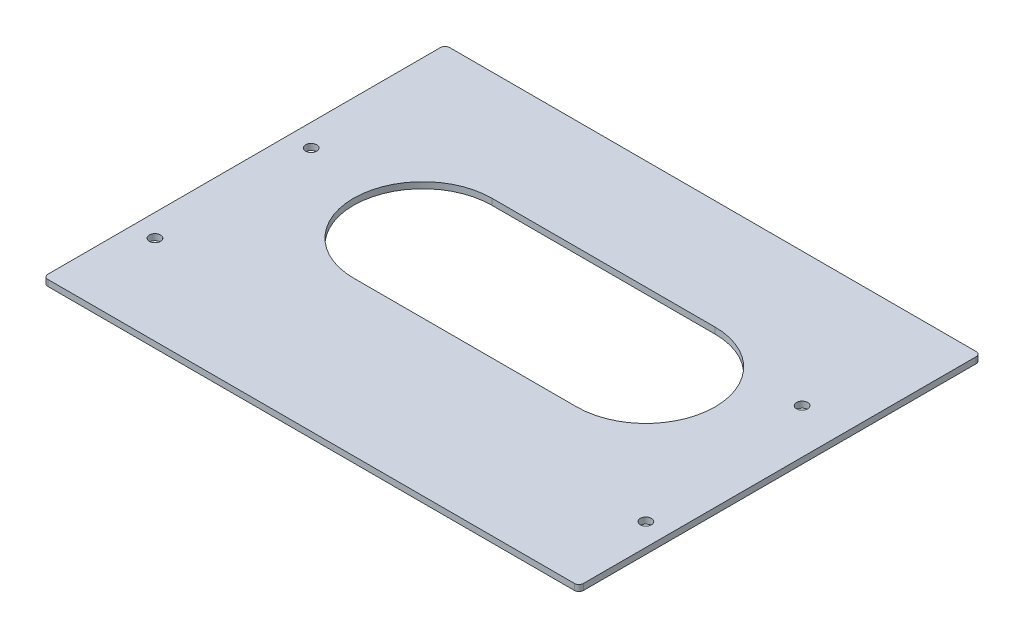
ISO-10303-21;
HEADER;
FILE_DESCRIPTION(('STEP AP214'),'2;1');
FILE_NAME('part.step','',(''),(''),'','','');
FILE_SCHEMA(('AUTOMOTIVE_DESIGN { 1 0 10303 214 1 1 1 1 }'));
ENDSEC;
DATA;
#1=APPLICATION_CONTEXT('core data for automotive mechanical design processes');
#2=APPLICATION_PROTOCOL_DEFINITION('international standard','automotive_design',2000,#1);
#3=PRODUCT_CONTEXT('',#1,'mechanical');
#4=PRODUCT('Part','Part','',(#3));
#5=PRODUCT_RELATED_PRODUCT_CATEGORY('part','',(#4));
#6=PRODUCT_DEFINITION_FORMATION('','',#4);
#7=PRODUCT_DEFINITION_CONTEXT('part definition',#1,'design');
#8=PRODUCT_DEFINITION('design','',#6,#7);
#9=PRODUCT_DEFINITION_SHAPE('','',#8);
#10=(LENGTH_UNIT() NAMED_UNIT(*) SI_UNIT(.MILLI.,.METRE.));
#11=(NAMED_UNIT(*) PLANE_ANGLE_UNIT() SI_UNIT($,.RADIAN.));
#12=(NAMED_UNIT(*) SI_UNIT($,.STERADIAN.) SOLID_ANGLE_UNIT());
#13=UNCERTAINTY_MEASURE_WITH_UNIT(LENGTH_MEASURE(1.E-05),#10,'distance_accuracy_value','');
#14=(GEOMETRIC_REPRESENTATION_CONTEXT(3) GLOBAL_UNCERTAINTY_ASSIGNED_CONTEXT((#13)) GLOBAL_UNIT_ASSIGNED_CONTEXT((#10,
#11,#12)) REPRESENTATION_CONTEXT('',''));
#15=CARTESIAN_POINT('',(0.,0.,0.));
#16=DIRECTION('',(0.,0.,1.));
#17=DIRECTION('',(1.,0.,0.));
#18=AXIS2_PLACEMENT_3D('',#15,#16,#17);
#19=CARTESIAN_POINT('',(172.766576592219,3.5,3.51802454518519));
#20=DIRECTION('',(0.,-1.,0.));
#21=DIRECTION('',(0.,0.,-1.));
#22=AXIS2_PLACEMENT_3D('',#19,#20,#21);
#23=CYLINDRICAL_SURFACE('',#22,2.53999999999999);
#24=CARTESIAN_POINT('',(172.766576592219,0.,3.51802454518519));
#25=DIRECTION('',(0.,1.,0.));
#26=DIRECTION('',(0.,0.,-1.));
#27=AXIS2_PLACEMENT_3D('',#24,#25,#26);
#28=CIRCLE('',#27,2.53999999999999);
#29=CARTESIAN_POINT('',(175.306576592219,0.,3.51802454518519));
#30=VERTEX_POINT('',#29);
#31=CARTESIAN_POINT('',(172.766576592219,0.,0.978024545185188));
#32=VERTEX_POINT('',#31);
#33=EDGE_CURVE('E159',#30,#32,#28,.T.);
#34=ORIENTED_EDGE('',*,*,#33,.T.);
#35=DIRECTION('',(0.,-1.,0.));
#36=VECTOR('',#35,1.);
#37=CARTESIAN_POINT('',(172.766576592219,3.5,0.978024545185188));
#38=LINE('',#37,#36);
#39=CARTESIAN_POINT('',(172.766576592219,3.5,0.978024545185188));
#40=VERTEX_POINT('',#39);
#41=EDGE_CURVE('E11',#40,#32,#38,.T.);
#42=ORIENTED_EDGE('',*,*,#41,.F.);
#43=CARTESIAN_POINT('',(172.766576592219,3.5,3.51802454518519));
#44=DIRECTION('',(0.,1.,0.));
#45=DIRECTION('',(0.,0.,-1.));
#46=AXIS2_PLACEMENT_3D('',#43,#44,#45);
#47=CIRCLE('',#46,2.53999999999999);
#48=CARTESIAN_POINT('',(175.306576592219,3.5,3.51802454518519));
#49=VERTEX_POINT('',#48);
#50=EDGE_CURVE('E163',#49,#40,#47,.T.);
#51=ORIENTED_EDGE('',*,*,#50,.F.);
#52=DIRECTION('',(0.,-1.,0.));
#53=VECTOR('',#52,1.);
#54=CARTESIAN_POINT('',(175.306576592219,3.5,3.51802454518519));
#55=LINE('',#54,#53);
#56=EDGE_CURVE('E181',#49,#30,#55,.T.);
#57=ORIENTED_EDGE('',*,*,#56,.T.);
#58=EDGE_LOOP('',(#34,#42,#51,#57));
#59=FACE_BOUND('',#58,.T.);
#60=ADVANCED_FACE('F34',(#59),#23,.T.);
#61=CARTESIAN_POINT('',(-126.953423407781,3.5,0.978024545185224));
#62=DIRECTION('',(0.,0.,1.));
#63=DIRECTION('',(1.,0.,0.));
#64=AXIS2_PLACEMENT_3D('',#61,#62,#63);
#65=PLANE('',#64);
#66=DIRECTION('',(-1.,0.,0.));
#67=VECTOR('',#66,1.);
#68=CARTESIAN_POINT('',(-126.953423407781,0.,0.978024545185224));
#69=LINE('',#68,#67);
#70=CARTESIAN_POINT('',(-126.953423407781,0.,0.978024545185224));
#71=VERTEX_POINT('',#70);
#72=EDGE_CURVE('E184',#32,#71,#69,.T.);
#73=ORIENTED_EDGE('',*,*,#72,.T.);
#74=DIRECTION('',(0.,-1.,0.));
#75=VECTOR('',#74,1.);
#76=CARTESIAN_POINT('',(-126.953423407781,3.5,0.978024545185224));
#77=LINE('',#76,#75);
#78=CARTESIAN_POINT('',(-126.953423407781,3.5,0.978024545185224));
#79=VERTEX_POINT('',#78);
#80=EDGE_CURVE('E41',#79,#71,#77,.T.);
#81=ORIENTED_EDGE('',*,*,#80,.F.);
#82=DIRECTION('',(-1.,0.,0.));
#83=VECTOR('',#82,1.);
#84=CARTESIAN_POINT('',(-126.953423407781,3.5,0.978024545185224));
#85=LINE('',#84,#83);
#86=EDGE_CURVE('E166',#40,#79,#85,.T.);
#87=ORIENTED_EDGE('',*,*,#86,.F.);
#88=ORIENTED_EDGE('',*,*,#41,.T.);
#89=EDGE_LOOP('',(#73,#81,#87,#88));
#90=FACE_BOUND('',#89,.T.);
#91=ADVANCED_FACE('F239',(#90),#65,.F.);
#92=CARTESIAN_POINT('',(-126.953423407781,3.5,3.51802454518522));
#93=DIRECTION('',(0.,-1.,0.));
#94=DIRECTION('',(0.,0.,-1.));
#95=AXIS2_PLACEMENT_3D('',#92,#93,#94);
#96=CYLINDRICAL_SURFACE('',#95,2.53999999999999);
#97=CARTESIAN_POINT('',(-126.953423407781,0.,3.51802454518522));
#98=DIRECTION('',(0.,1.,0.));
#99=DIRECTION('',(0.,0.,-1.));
#100=AXIS2_PLACEMENT_3D('',#97,#98,#99);
#101=CIRCLE('',#100,2.53999999999999);
#102=CARTESIAN_POINT('',(-129.493423407781,0.,3.51802454518522));
#103=VERTEX_POINT('',#102);
#104=EDGE_CURVE('E186',#71,#103,#101,.T.);
#105=ORIENTED_EDGE('',*,*,#104,.T.);
#106=DIRECTION('',(0.,-1.,0.));
#107=VECTOR('',#106,1.);
#108=CARTESIAN_POINT('',(-129.493423407781,3.5,3.51802454518522));
#109=LINE('',#108,#107);
#110=CARTESIAN_POINT('',(-129.493423407781,3.5,3.51802454518522));
#111=VERTEX_POINT('',#110);
#112=EDGE_CURVE('E211',#111,#103,#109,.T.);
#113=ORIENTED_EDGE('',*,*,#112,.F.);
#114=CARTESIAN_POINT('',(-126.953423407781,3.5,3.51802454518522));
#115=DIRECTION('',(0.,1.,0.));
#116=DIRECTION('',(0.,0.,-1.));
#117=AXIS2_PLACEMENT_3D('',#114,#115,#116);
#118=CIRCLE('',#117,2.53999999999999);
#119=EDGE_CURVE('E169',#79,#111,#118,.T.);
#120=ORIENTED_EDGE('',*,*,#119,.F.);
#121=ORIENTED_EDGE('',*,*,#80,.T.);
#122=EDGE_LOOP('',(#105,#113,#120,#121));
#123=FACE_BOUND('',#122,.T.);
#124=ADVANCED_FACE('F218',(#123),#96,.T.);
#125=CARTESIAN_POINT('',(-129.493423407781,3.5,3.51802454518522));
#126=DIRECTION('',(1.,0.,0.));
#127=DIRECTION('',(0.,0.,-1.));
#128=AXIS2_PLACEMENT_3D('',#125,#126,#127);
#129=PLANE('',#128);
#130=DIRECTION('',(0.,0.,1.));
#131=VECTOR('',#130,1.);
#132=CARTESIAN_POINT('',(-129.493423407781,0.,3.51802454518522));
#133=LINE('',#132,#131);
#134=CARTESIAN_POINT('',(-129.493423407781,0.,227.038024545185));
#135=VERTEX_POINT('',#134);
#136=EDGE_CURVE('E188',#103,#135,#133,.T.);
#137=ORIENTED_EDGE('',*,*,#136,.T.);
#138=DIRECTION('',(0.,-1.,0.));
#139=VECTOR('',#138,1.);
#140=CARTESIAN_POINT('',(-129.493423407781,3.5,227.038024545185));
#141=LINE('',#140,#139);
#142=CARTESIAN_POINT('',(-129.493423407781,3.5,227.038024545185));
#143=VERTEX_POINT('',#142);
#144=EDGE_CURVE('E208',#143,#135,#141,.T.);
#145=ORIENTED_EDGE('',*,*,#144,.F.);
#146=DIRECTION('',(0.,0.,1.));
#147=VECTOR('',#146,1.);
#148=CARTESIAN_POINT('',(-129.493423407781,3.5,3.51802454518522));
#149=LINE('',#148,#147);
#150=EDGE_CURVE('E171',#111,#143,#149,.T.);
#151=ORIENTED_EDGE('',*,*,#150,.F.);
#152=ORIENTED_EDGE('',*,*,#112,.T.);
#153=EDGE_LOOP('',(#137,#145,#151,#152));
#154=FACE_BOUND('',#153,.T.);
#155=ADVANCED_FACE('F229',(#154),#129,.F.);
#156=CARTESIAN_POINT('',(-126.953423407781,3.5,227.038024545185));
#157=DIRECTION('',(0.,-1.,0.));
#158=DIRECTION('',(0.,0.,-1.));
#159=AXIS2_PLACEMENT_3D('',#156,#157,#158);
#160=CYLINDRICAL_SURFACE('',#159,2.53999999999997);
#161=CARTESIAN_POINT('',(-126.953423407781,0.,227.038024545185));
#162=DIRECTION('',(0.,1.,0.));
#163=DIRECTION('',(0.,0.,-1.));
#164=AXIS2_PLACEMENT_3D('',#161,#162,#163);
#165=CIRCLE('',#164,2.53999999999997);
#166=CARTESIAN_POINT('',(-126.953423407781,0.,229.578024545185));
#167=VERTEX_POINT('',#166);
#168=EDGE_CURVE('E190',#135,#167,#165,.T.);
#169=ORIENTED_EDGE('',*,*,#168,.T.);
#170=DIRECTION('',(0.,-1.,0.));
#171=VECTOR('',#170,1.);
#172=CARTESIAN_POINT('',(-126.953423407781,3.5,229.578024545185));
#173=LINE('',#172,#171);
#174=CARTESIAN_POINT('',(-126.953423407781,3.5,229.578024545185));
#175=VERTEX_POINT('',#174);
#176=EDGE_CURVE('E205',#175,#167,#173,.T.);
#177=ORIENTED_EDGE('',*,*,#176,.F.);
#178=CARTESIAN_POINT('',(-126.953423407781,3.5,227.038024545185));
#179=DIRECTION('',(0.,1.,0.));
#180=DIRECTION('',(0.,0.,-1.));
#181=AXIS2_PLACEMENT_3D('',#178,#179,#180);
#182=CIRCLE('',#181,2.53999999999997);
#183=EDGE_CURVE('E173',#143,#175,#182,.T.);
#184=ORIENTED_EDGE('',*,*,#183,.F.);
#185=ORIENTED_EDGE('',*,*,#144,.T.);
#186=EDGE_LOOP('',(#169,#177,#184,#185));
#187=FACE_BOUND('',#186,.T.);
#188=ADVANCED_FACE('F233',(#187),#160,.T.);
#189=CARTESIAN_POINT('',(-126.953423407781,3.5,229.578024545185));
#190=DIRECTION('',(0.,0.,-1.));
#191=DIRECTION('',(-1.,0.,0.));
#192=AXIS2_PLACEMENT_3D('',#189,#190,#191);
#193=PLANE('',#192);
#194=DIRECTION('',(1.,0.,0.));
#195=VECTOR('',#194,1.);
#196=CARTESIAN_POINT('',(-126.953423407781,0.,229.578024545185));
#197=LINE('',#196,#195);
#198=CARTESIAN_POINT('',(172.766576592219,0.,229.578024545185));
#199=VERTEX_POINT('',#198);
#200=EDGE_CURVE('E192',#167,#199,#197,.T.);
#201=ORIENTED_EDGE('',*,*,#200,.T.);
#202=DIRECTION('',(0.,-1.,0.));
#203=VECTOR('',#202,1.);
#204=CARTESIAN_POINT('',(172.766576592219,3.5,229.578024545185));
#205=LINE('',#204,#203);
#206=CARTESIAN_POINT('',(172.766576592219,3.5,229.578024545185));
#207=VERTEX_POINT('',#206);
#208=EDGE_CURVE('E202',#207,#199,#205,.T.);
#209=ORIENTED_EDGE('',*,*,#208,.F.);
#210=DIRECTION('',(1.,0.,0.));
#211=VECTOR('',#210,1.);
#212=CARTESIAN_POINT('',(-126.953423407781,3.5,229.578024545185));
#213=LINE('',#212,#211);
#214=EDGE_CURVE('E175',#175,#207,#213,.T.);
#215=ORIENTED_EDGE('',*,*,#214,.F.);
#216=ORIENTED_EDGE('',*,*,#176,.T.);
#217=EDGE_LOOP('',(#201,#209,#215,#216));
#218=FACE_BOUND('',#217,.T.);
#219=ADVANCED_FACE('F252',(#218),#193,.F.);
#220=CARTESIAN_POINT('',(172.766576592219,3.5,227.038024545185));
#221=DIRECTION('',(0.,-1.,0.));
#222=DIRECTION('',(0.,0.,-1.));
#223=AXIS2_PLACEMENT_3D('',#220,#221,#222);
#224=CYLINDRICAL_SURFACE('',#223,2.53999999999997);
#225=CARTESIAN_POINT('',(172.766576592219,0.,227.038024545185));
#226=DIRECTION('',(0.,1.,0.));
#227=DIRECTION('',(0.,0.,-1.));
#228=AXIS2_PLACEMENT_3D('',#225,#226,#227);
#229=CIRCLE('',#228,2.53999999999997);
#230=CARTESIAN_POINT('',(175.306576592219,0.,227.038024545185));
#231=VERTEX_POINT('',#230);
#232=EDGE_CURVE('E194',#199,#231,#229,.T.);
#233=ORIENTED_EDGE('',*,*,#232,.T.);
#234=DIRECTION('',(0.,-1.,0.));
#235=VECTOR('',#234,1.);
#236=CARTESIAN_POINT('',(175.306576592219,3.5,227.038024545185));
#237=LINE('',#236,#235);
#238=CARTESIAN_POINT('',(175.306576592219,3.5,227.038024545185));
#239=VERTEX_POINT('',#238);
#240=EDGE_CURVE('E199',#239,#231,#237,.T.);
#241=ORIENTED_EDGE('',*,*,#240,.F.);
#242=CARTESIAN_POINT('',(172.766576592219,3.5,227.038024545185));
#243=DIRECTION('',(0.,1.,0.));
#244=DIRECTION('',(0.,0.,-1.));
#245=AXIS2_PLACEMENT_3D('',#242,#243,#244);
#246=CIRCLE('',#245,2.53999999999997);
#247=EDGE_CURVE('E177',#207,#239,#246,.T.);
#248=ORIENTED_EDGE('',*,*,#247,.F.);
#249=ORIENTED_EDGE('',*,*,#208,.T.);
#250=EDGE_LOOP('',(#233,#241,#248,#249));
#251=FACE_BOUND('',#250,.T.);
#252=ADVANCED_FACE('F250',(#251),#224,.T.);
#253=CARTESIAN_POINT('',(175.306576592219,3.5,3.51802454518519));
#254=DIRECTION('',(-1.,0.,0.));
#255=DIRECTION('',(0.,0.,1.));
#256=AXIS2_PLACEMENT_3D('',#253,#254,#255);
#257=PLANE('',#256);
#258=DIRECTION('',(0.,0.,-1.));
#259=VECTOR('',#258,1.);
#260=CARTESIAN_POINT('',(175.306576592219,0.,3.51802454518519));
#261=LINE('',#260,#259);
#262=EDGE_CURVE('E167',#231,#30,#261,.T.);
#263=ORIENTED_EDGE('',*,*,#262,.T.);
#264=ORIENTED_EDGE('',*,*,#56,.F.);
#265=DIRECTION('',(0.,0.,-1.));
#266=VECTOR('',#265,1.);
#267=CARTESIAN_POINT('',(175.306576592219,3.5,3.51802454518519));
#268=LINE('',#267,#266);
#269=EDGE_CURVE('E179',#239,#49,#268,.T.);
#270=ORIENTED_EDGE('',*,*,#269,.F.);
#271=ORIENTED_EDGE('',*,*,#240,.T.);
#272=EDGE_LOOP('',(#263,#264,#270,#271));
#273=FACE_BOUND('',#272,.T.);
#274=ADVANCED_FACE('F245',(#273),#257,.F.);
#275=CARTESIAN_POINT('',(172.766576592219,3.5,3.51802454518519));
#276=DIRECTION('',(0.,-1.,0.));
#277=DIRECTION('',(0.,0.,-1.));
#278=AXIS2_PLACEMENT_3D('',#275,#276,#277);
#279=PLANE('',#278);
#280=CARTESIAN_POINT('',(-116.793423407781,3.5,89.8780245451813));
#281=DIRECTION('',(0.,-1.,0.));
#282=DIRECTION('',(0.,0.,-1.));
#283=AXIS2_PLACEMENT_3D('',#280,#281,#282);
#284=CIRCLE('',#283,3.17499999999997);
#285=CARTESIAN_POINT('',(-116.793423407781,3.5,86.7030245451813));
#286=VERTEX_POINT('',#285);
#287=EDGE_CURVE('E397',#286,#286,#284,.T.);
#288=ORIENTED_EDGE('',*,*,#287,.T.);
#289=EDGE_LOOP('',(#288));
#290=FACE_BOUND('',#289,.T.);
#291=CARTESIAN_POINT('',(-116.793423407782,3.5,178.778024545181));
#292=DIRECTION('',(0.,-1.,0.));
#293=DIRECTION('',(0.,0.,-1.));
#294=AXIS2_PLACEMENT_3D('',#291,#292,#293);
#295=CIRCLE('',#294,3.17499999999997);
#296=CARTESIAN_POINT('',(-116.793423407782,3.5,175.603024545181));
#297=VERTEX_POINT('',#296);
#298=EDGE_CURVE('E401',#297,#297,#295,.T.);
#299=ORIENTED_EDGE('',*,*,#298,.T.);
#300=EDGE_LOOP('',(#299));
#301=FACE_BOUND('',#300,.T.);
#302=CARTESIAN_POINT('',(162.606576592218,3.5,178.778024545185));
#303=DIRECTION('',(0.,-1.,0.));
#304=DIRECTION('',(0.,0.,-1.));
#305=AXIS2_PLACEMENT_3D('',#302,#303,#304);
#306=CIRCLE('',#305,3.17499999999997);
#307=CARTESIAN_POINT('',(162.606576592218,3.5,175.603024545185));
#308=VERTEX_POINT('',#307);
#309=EDGE_CURVE('E410',#308,#308,#306,.T.);
#310=ORIENTED_EDGE('',*,*,#309,.T.);
#311=EDGE_LOOP('',(#310));
#312=FACE_BOUND('',#311,.T.);
#313=CARTESIAN_POINT('',(149.906576592219,3.5,77.1780245451852));
#314=DIRECTION('',(0.,-1.,0.));
#315=DIRECTION('',(0.,0.,-1.));
#316=AXIS2_PLACEMENT_3D('',#313,#314,#315);
#317=CIRCLE('',#316,3.175);
#318=CARTESIAN_POINT('',(149.906576592219,3.5,74.0030245451852));
#319=VERTEX_POINT('',#318);
#320=EDGE_CURVE('E153',#319,#319,#317,.T.);
#321=ORIENTED_EDGE('',*,*,#320,.T.);
#322=EDGE_LOOP('',(#321));
#323=FACE_BOUND('',#322,.T.);
#324=DIRECTION('',(1.,0.,0.));
#325=VECTOR('',#324,1.);
#326=CARTESIAN_POINT('',(-40.593423407781,3.5,141.948024545185));
#327=LINE('',#326,#325);
#328=CARTESIAN_POINT('',(-40.593423407781,3.5,141.948024545185));
#329=VERTEX_POINT('',#328);
#330=CARTESIAN_POINT('',(86.406576592219,3.5,141.948024545185));
#331=VERTEX_POINT('',#330);
#332=EDGE_CURVE('E131',#329,#331,#327,.T.);
#333=ORIENTED_EDGE('',*,*,#332,.F.);
#334=CARTESIAN_POINT('',(-40.593423407781,3.5,102.578024545185));
#335=DIRECTION('',(0.,-1.,0.));
#336=DIRECTION('',(0.,0.,-1.));
#337=AXIS2_PLACEMENT_3D('',#334,#335,#336);
#338=CIRCLE('',#337,39.37);
#339=CARTESIAN_POINT('',(-40.593423407781,3.5,63.2080245451852));
#340=VERTEX_POINT('',#339);
#341=EDGE_CURVE('E125',#329,#340,#338,.T.);
#342=ORIENTED_EDGE('',*,*,#341,.T.);
#343=DIRECTION('',(1.,0.,0.));
#344=VECTOR('',#343,1.);
#345=CARTESIAN_POINT('',(-40.593423407781,3.5,63.2080245451852));
#346=LINE('',#345,#344);
#347=CARTESIAN_POINT('',(86.406576592219,3.5,63.2080245451852));
#348=VERTEX_POINT('',#347);
#349=EDGE_CURVE('E134',#340,#348,#346,.T.);
#350=ORIENTED_EDGE('',*,*,#349,.T.);
#351=CARTESIAN_POINT('',(86.406576592219,3.5,102.578024545185));
#352=DIRECTION('',(0.,-1.,0.));
#353=DIRECTION('',(0.,0.,-1.));
#354=AXIS2_PLACEMENT_3D('',#351,#352,#353);
#355=CIRCLE('',#354,39.37);
#356=EDGE_CURVE('E48',#348,#331,#355,.T.);
#357=ORIENTED_EDGE('',*,*,#356,.T.);
#358=EDGE_LOOP('',(#333,#342,#350,#357));
#359=FACE_BOUND('',#358,.T.);
#360=ORIENTED_EDGE('',*,*,#50,.T.);
#361=ORIENTED_EDGE('',*,*,#86,.T.);
#362=ORIENTED_EDGE('',*,*,#119,.T.);
#363=ORIENTED_EDGE('',*,*,#150,.T.);
#364=ORIENTED_EDGE('',*,*,#183,.T.);
#365=ORIENTED_EDGE('',*,*,#214,.T.);
#366=ORIENTED_EDGE('',*,*,#247,.T.);
#367=ORIENTED_EDGE('',*,*,#269,.T.);
#368=EDGE_LOOP('',(#360,#361,#362,#363,#364,#365,#366,#367));
#369=FACE_BOUND('',#368,.T.);
#370=ADVANCED_FACE('F138',(#290,#301,#312,#323,#359,#369),#279,.F.);
#371=CARTESIAN_POINT('',(172.766576592219,0.,3.51802454518519));
#372=DIRECTION('',(0.,-1.,0.));
#373=DIRECTION('',(0.,0.,-1.));
#374=AXIS2_PLACEMENT_3D('',#371,#372,#373);
#375=PLANE('',#374);
#376=CARTESIAN_POINT('',(-116.793423407781,0.,89.8780245451813));
#377=DIRECTION('',(0.,-1.,0.));
#378=DIRECTION('',(0.,0.,-1.));
#379=AXIS2_PLACEMENT_3D('',#376,#377,#378);
#380=CIRCLE('',#379,3.17499999999997);
#381=CARTESIAN_POINT('',(-116.793423407781,0.,86.7030245451813));
#382=VERTEX_POINT('',#381);
#383=EDGE_CURVE('E400',#382,#382,#380,.T.);
#384=ORIENTED_EDGE('',*,*,#383,.F.);
#385=EDGE_LOOP('',(#384));
#386=FACE_BOUND('',#385,.T.);
#387=CARTESIAN_POINT('',(-116.793423407782,0.,178.778024545181));
#388=DIRECTION('',(0.,-1.,0.));
#389=DIRECTION('',(0.,0.,-1.));
#390=AXIS2_PLACEMENT_3D('',#387,#388,#389);
#391=CIRCLE('',#390,3.17499999999997);
#392=CARTESIAN_POINT('',(-116.793423407782,0.,175.603024545181));
#393=VERTEX_POINT('',#392);
#394=EDGE_CURVE('E405',#393,#393,#391,.T.);
#395=ORIENTED_EDGE('',*,*,#394,.F.);
#396=EDGE_LOOP('',(#395));
#397=FACE_BOUND('',#396,.T.);
#398=CARTESIAN_POINT('',(162.606576592218,0.,178.778024545185));
#399=DIRECTION('',(0.,-1.,0.));
#400=DIRECTION('',(0.,0.,-1.));
#401=AXIS2_PLACEMENT_3D('',#398,#399,#400);
#402=CIRCLE('',#401,3.17499999999997);
#403=CARTESIAN_POINT('',(162.606576592218,0.,175.603024545185));
#404=VERTEX_POINT('',#403);
#405=EDGE_CURVE('E413',#404,#404,#402,.T.);
#406=ORIENTED_EDGE('',*,*,#405,.F.);
#407=EDGE_LOOP('',(#406));
#408=FACE_BOUND('',#407,.T.);
#409=CARTESIAN_POINT('',(149.906576592219,0.,77.1780245451852));
#410=DIRECTION('',(0.,-1.,0.));
#411=DIRECTION('',(0.,0.,-1.));
#412=AXIS2_PLACEMENT_3D('',#409,#410,#411);
#413=CIRCLE('',#412,3.175);
#414=CARTESIAN_POINT('',(149.906576592219,0.,74.0030245451852));
#415=VERTEX_POINT('',#414);
#416=EDGE_CURVE('E146',#415,#415,#413,.T.);
#417=ORIENTED_EDGE('',*,*,#416,.F.);
#418=EDGE_LOOP('',(#417));
#419=FACE_BOUND('',#418,.T.);
#420=CARTESIAN_POINT('',(-40.593423407781,0.,102.578024545185));
#421=DIRECTION('',(0.,-1.,0.));
#422=DIRECTION('',(0.,0.,-1.));
#423=AXIS2_PLACEMENT_3D('',#420,#421,#422);
#424=CIRCLE('',#423,39.37);
#425=CARTESIAN_POINT('',(-40.593423407781,0.,141.948024545185));
#426=VERTEX_POINT('',#425);
#427=CARTESIAN_POINT('',(-40.593423407781,0.,63.2080245451852));
#428=VERTEX_POINT('',#427);
#429=EDGE_CURVE('E56',#426,#428,#424,.T.);
#430=ORIENTED_EDGE('',*,*,#429,.F.);
#431=DIRECTION('',(1.,0.,0.));
#432=VECTOR('',#431,1.);
#433=CARTESIAN_POINT('',(-40.593423407781,0.,141.948024545185));
#434=LINE('',#433,#432);
#435=CARTESIAN_POINT('',(86.406576592219,0.,141.948024545185));
#436=VERTEX_POINT('',#435);
#437=EDGE_CURVE('E140',#426,#436,#434,.T.);
#438=ORIENTED_EDGE('',*,*,#437,.T.);
#439=CARTESIAN_POINT('',(86.406576592219,0.,102.578024545185));
#440=DIRECTION('',(0.,-1.,0.));
#441=DIRECTION('',(0.,0.,-1.));
#442=AXIS2_PLACEMENT_3D('',#439,#440,#441);
#443=CIRCLE('',#442,39.37);
#444=CARTESIAN_POINT('',(86.406576592219,0.,63.2080245451852));
#445=VERTEX_POINT('',#444);
#446=EDGE_CURVE('E143',#445,#436,#443,.T.);
#447=ORIENTED_EDGE('',*,*,#446,.F.);
#448=DIRECTION('',(1.,0.,0.));
#449=VECTOR('',#448,1.);
#450=CARTESIAN_POINT('',(-40.593423407781,0.,63.2080245451852));
#451=LINE('',#450,#449);
#452=EDGE_CURVE('E152',#428,#445,#451,.T.);
#453=ORIENTED_EDGE('',*,*,#452,.F.);
#454=EDGE_LOOP('',(#430,#438,#447,#453));
#455=FACE_BOUND('',#454,.T.);
#456=ORIENTED_EDGE('',*,*,#33,.F.);
#457=ORIENTED_EDGE('',*,*,#262,.F.);
#458=ORIENTED_EDGE('',*,*,#232,.F.);
#459=ORIENTED_EDGE('',*,*,#200,.F.);
#460=ORIENTED_EDGE('',*,*,#168,.F.);
#461=ORIENTED_EDGE('',*,*,#136,.F.);
#462=ORIENTED_EDGE('',*,*,#104,.F.);
#463=ORIENTED_EDGE('',*,*,#72,.F.);
#464=EDGE_LOOP('',(#456,#457,#458,#459,#460,#461,#462,#463));
#465=FACE_BOUND('',#464,.T.);
#466=ADVANCED_FACE('F224',(#386,#397,#408,#419,#455,#465),#375,.T.);
#467=CARTESIAN_POINT('',(-40.593423407781,3.5,102.578024545185));
#468=DIRECTION('',(0.,-1.,0.));
#469=DIRECTION('',(0.,0.,-1.));
#470=AXIS2_PLACEMENT_3D('',#467,#468,#469);
#471=CYLINDRICAL_SURFACE('',#470,39.37);
#472=ORIENTED_EDGE('',*,*,#429,.T.);
#473=DIRECTION('',(0.,-1.,0.));
#474=VECTOR('',#473,1.);
#475=CARTESIAN_POINT('',(-40.593423407781,3.5,63.2080245451852));
#476=LINE('',#475,#474);
#477=EDGE_CURVE('E121',#340,#428,#476,.T.);
#478=ORIENTED_EDGE('',*,*,#477,.F.);
#479=ORIENTED_EDGE('',*,*,#341,.F.);
#480=DIRECTION('',(0.,-1.,0.));
#481=VECTOR('',#480,1.);
#482=CARTESIAN_POINT('',(-40.593423407781,3.5,141.948024545185));
#483=LINE('',#482,#481);
#484=EDGE_CURVE('E157',#329,#426,#483,.T.);
#485=ORIENTED_EDGE('',*,*,#484,.T.);
#486=EDGE_LOOP('',(#472,#478,#479,#485));
#487=FACE_BOUND('',#486,.T.);
#488=ADVANCED_FACE('F123',(#487),#471,.F.);
#489=CARTESIAN_POINT('',(-40.593423407781,3.5,141.948024545185));
#490=DIRECTION('',(0.,0.,-1.));
#491=DIRECTION('',(-1.,0.,0.));
#492=AXIS2_PLACEMENT_3D('',#489,#490,#491);
#493=PLANE('',#492);
#494=ORIENTED_EDGE('',*,*,#437,.F.);
#495=ORIENTED_EDGE('',*,*,#484,.F.);
#496=ORIENTED_EDGE('',*,*,#332,.T.);
#497=DIRECTION('',(0.,-1.,0.));
#498=VECTOR('',#497,1.);
#499=CARTESIAN_POINT('',(86.406576592219,3.5,141.948024545185));
#500=LINE('',#499,#498);
#501=EDGE_CURVE('E160',#331,#436,#500,.T.);
#502=ORIENTED_EDGE('',*,*,#501,.T.);
#503=EDGE_LOOP('',(#494,#495,#496,#502));
#504=FACE_BOUND('',#503,.T.);
#505=ADVANCED_FACE('F308',(#504),#493,.T.);
#506=CARTESIAN_POINT('',(86.406576592219,3.5,102.578024545185));
#507=DIRECTION('',(0.,-1.,0.));
#508=DIRECTION('',(0.,0.,-1.));
#509=AXIS2_PLACEMENT_3D('',#506,#507,#508);
#510=CYLINDRICAL_SURFACE('',#509,39.37);
#511=ORIENTED_EDGE('',*,*,#446,.T.);
#512=ORIENTED_EDGE('',*,*,#501,.F.);
#513=ORIENTED_EDGE('',*,*,#356,.F.);
#514=DIRECTION('',(0.,-1.,0.));
#515=VECTOR('',#514,1.);
#516=CARTESIAN_POINT('',(86.406576592219,3.5,63.2080245451852));
#517=LINE('',#516,#515);
#518=EDGE_CURVE('E130',#348,#445,#517,.T.);
#519=ORIENTED_EDGE('',*,*,#518,.T.);
#520=EDGE_LOOP('',(#511,#512,#513,#519));
#521=FACE_BOUND('',#520,.T.);
#522=ADVANCED_FACE('F319',(#521),#510,.F.);
#523=CARTESIAN_POINT('',(-40.593423407781,3.5,63.2080245451852));
#524=DIRECTION('',(0.,0.,-1.));
#525=DIRECTION('',(-1.,0.,0.));
#526=AXIS2_PLACEMENT_3D('',#523,#524,#525);
#527=PLANE('',#526);
#528=ORIENTED_EDGE('',*,*,#452,.T.);
#529=ORIENTED_EDGE('',*,*,#518,.F.);
#530=ORIENTED_EDGE('',*,*,#349,.F.);
#531=ORIENTED_EDGE('',*,*,#477,.T.);
#532=EDGE_LOOP('',(#528,#529,#530,#531));
#533=FACE_BOUND('',#532,.T.);
#534=ADVANCED_FACE('F135',(#533),#527,.F.);
#535=CARTESIAN_POINT('',(149.906576592219,3.5,77.1780245451852));
#536=DIRECTION('',(0.,-1.,0.));
#537=DIRECTION('',(0.,0.,-1.));
#538=AXIS2_PLACEMENT_3D('',#535,#536,#537);
#539=CYLINDRICAL_SURFACE('',#538,3.175);
#540=ORIENTED_EDGE('',*,*,#320,.F.);
#541=EDGE_LOOP('',(#540));
#542=FACE_BOUND('',#541,.T.);
#543=ORIENTED_EDGE('',*,*,#416,.T.);
#544=EDGE_LOOP('',(#543));
#545=FACE_BOUND('',#544,.T.);
#546=ADVANCED_FACE('F337',(#542,#545),#539,.F.);
#547=CARTESIAN_POINT('',(162.606576592218,3.5,178.778024545185));
#548=DIRECTION('',(0.,-1.,0.));
#549=DIRECTION('',(0.,0.,-1.));
#550=AXIS2_PLACEMENT_3D('',#547,#548,#549);
#551=CYLINDRICAL_SURFACE('',#550,3.17499999999997);
#552=ORIENTED_EDGE('',*,*,#309,.F.);
#553=EDGE_LOOP('',(#552));
#554=FACE_BOUND('',#553,.T.);
#555=ORIENTED_EDGE('',*,*,#405,.T.);
#556=EDGE_LOOP('',(#555));
#557=FACE_BOUND('',#556,.T.);
#558=ADVANCED_FACE('F360',(#554,#557),#551,.F.);
#559=CARTESIAN_POINT('',(-116.793423407782,3.5,178.778024545181));
#560=DIRECTION('',(0.,-1.,0.));
#561=DIRECTION('',(0.,0.,-1.));
#562=AXIS2_PLACEMENT_3D('',#559,#560,#561);
#563=CYLINDRICAL_SURFACE('',#562,3.17499999999997);
#564=ORIENTED_EDGE('',*,*,#298,.F.);
#565=EDGE_LOOP('',(#564));
#566=FACE_BOUND('',#565,.T.);
#567=ORIENTED_EDGE('',*,*,#394,.T.);
#568=EDGE_LOOP('',(#567));
#569=FACE_BOUND('',#568,.T.);
#570=ADVANCED_FACE('F370',(#566,#569),#563,.F.);
#571=CARTESIAN_POINT('',(-116.793423407781,3.5,89.8780245451813));
#572=DIRECTION('',(0.,-1.,0.));
#573=DIRECTION('',(0.,0.,-1.));
#574=AXIS2_PLACEMENT_3D('',#571,#572,#573);
#575=CYLINDRICAL_SURFACE('',#574,3.17499999999997);
#576=ORIENTED_EDGE('',*,*,#287,.F.);
#577=EDGE_LOOP('',(#576));
#578=FACE_BOUND('',#577,.T.);
#579=ORIENTED_EDGE('',*,*,#383,.T.);
#580=EDGE_LOOP('',(#579));
#581=FACE_BOUND('',#580,.T.);
#582=ADVANCED_FACE('F380',(#578,#581),#575,.F.);
#583=CLOSED_SHELL('',(#60,#91,#124,#155,#188,#219,#252,#274,#370,#466,#488,#505,#522,#534,#546,
#558,#570,#582));
#584=MANIFOLD_SOLID_BREP('B2',#583);
#585=ADVANCED_BREP_SHAPE_REPRESENTATION('',(#18,#584),#14);
#586=SHAPE_DEFINITION_REPRESENTATION(#9,#585);
ENDSEC;
END-ISO-10303-21;
